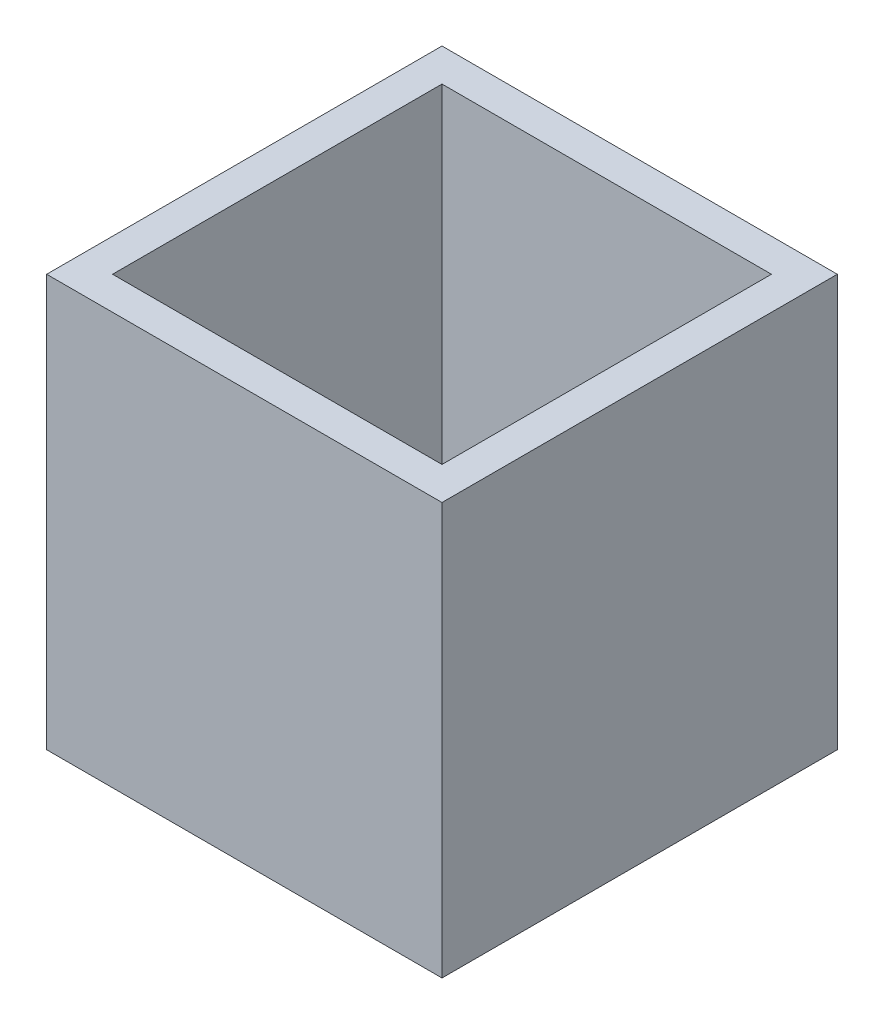
ISO-10303-21;
HEADER;
FILE_DESCRIPTION(('STEP AP214'),'2;1');
FILE_NAME('part.step','',(''),(''),'','','');
FILE_SCHEMA(('AUTOMOTIVE_DESIGN { 1 0 10303 214 1 1 1 1 }'));
ENDSEC;
DATA;
#1=APPLICATION_CONTEXT('core data for automotive mechanical design processes');
#2=APPLICATION_PROTOCOL_DEFINITION('international standard','automotive_design',2000,#1);
#3=PRODUCT_CONTEXT('',#1,'mechanical');
#4=PRODUCT('Part','Part','',(#3));
#5=PRODUCT_RELATED_PRODUCT_CATEGORY('part','',(#4));
#6=PRODUCT_DEFINITION_FORMATION('','',#4);
#7=PRODUCT_DEFINITION_CONTEXT('part definition',#1,'design');
#8=PRODUCT_DEFINITION('design','',#6,#7);
#9=PRODUCT_DEFINITION_SHAPE('','',#8);
#10=(LENGTH_UNIT() NAMED_UNIT(*) SI_UNIT(.MILLI.,.METRE.));
#11=(NAMED_UNIT(*) PLANE_ANGLE_UNIT() SI_UNIT($,.RADIAN.));
#12=(NAMED_UNIT(*) SI_UNIT($,.STERADIAN.) SOLID_ANGLE_UNIT());
#13=UNCERTAINTY_MEASURE_WITH_UNIT(LENGTH_MEASURE(1.E-05),#10,'distance_accuracy_value','');
#14=(GEOMETRIC_REPRESENTATION_CONTEXT(3) GLOBAL_UNCERTAINTY_ASSIGNED_CONTEXT((#13)) GLOBAL_UNIT_ASSIGNED_CONTEXT((#10,
#11,#12)) REPRESENTATION_CONTEXT('',''));
#15=CARTESIAN_POINT('',(0.,0.,0.));
#16=DIRECTION('',(0.,0.,1.));
#17=DIRECTION('',(1.,0.,0.));
#18=AXIS2_PLACEMENT_3D('',#15,#16,#17);
#19=CARTESIAN_POINT('',(0.,5.,0.));
#20=DIRECTION('',(0.,-1.,0.));
#21=DIRECTION('',(0.,0.,-1.));
#22=AXIS2_PLACEMENT_3D('',#19,#20,#21);
#23=PLANE('',#22);
#24=DIRECTION('',(0.,0.,-1.));
#25=VECTOR('',#24,1.);
#26=CARTESIAN_POINT('',(2.4,5.,2.4));
#27=LINE('',#26,#25);
#28=CARTESIAN_POINT('',(2.4,5.,2.4));
#29=VERTEX_POINT('',#28);
#30=CARTESIAN_POINT('',(2.4,5.,-2.4));
#31=VERTEX_POINT('',#30);
#32=EDGE_CURVE('E138',#29,#31,#27,.T.);
#33=ORIENTED_EDGE('',*,*,#32,.T.);
#34=DIRECTION('',(-1.,0.,0.));
#35=VECTOR('',#34,1.);
#36=CARTESIAN_POINT('',(-2.4,5.,-2.4));
#37=LINE('',#36,#35);
#38=CARTESIAN_POINT('',(-2.4,5.,-2.4));
#39=VERTEX_POINT('',#38);
#40=EDGE_CURVE('E141',#31,#39,#37,.T.);
#41=ORIENTED_EDGE('',*,*,#40,.T.);
#42=DIRECTION('',(0.,0.,1.));
#43=VECTOR('',#42,1.);
#44=CARTESIAN_POINT('',(-2.4,5.,2.4));
#45=LINE('',#44,#43);
#46=CARTESIAN_POINT('',(-2.4,5.,2.4));
#47=VERTEX_POINT('',#46);
#48=EDGE_CURVE('E144',#39,#47,#45,.T.);
#49=ORIENTED_EDGE('',*,*,#48,.T.);
#50=DIRECTION('',(1.,0.,0.));
#51=VECTOR('',#50,1.);
#52=CARTESIAN_POINT('',(-2.4,5.,2.4));
#53=LINE('',#52,#51);
#54=EDGE_CURVE('E146',#47,#29,#53,.T.);
#55=ORIENTED_EDGE('',*,*,#54,.T.);
#56=EDGE_LOOP('',(#33,#41,#49,#55));
#57=FACE_BOUND('',#56,.T.);
#58=DIRECTION('',(0.,0.,-1.));
#59=VECTOR('',#58,1.);
#60=CARTESIAN_POINT('',(2.,5.,2.));
#61=LINE('',#60,#59);
#62=CARTESIAN_POINT('',(2.,5.,2.));
#63=VERTEX_POINT('',#62);
#64=CARTESIAN_POINT('',(2.,5.,-2.));
#65=VERTEX_POINT('',#64);
#66=EDGE_CURVE('E102',#63,#65,#61,.T.);
#67=ORIENTED_EDGE('',*,*,#66,.F.);
#68=DIRECTION('',(1.,0.,0.));
#69=VECTOR('',#68,1.);
#70=CARTESIAN_POINT('',(-2.,5.,2.));
#71=LINE('',#70,#69);
#72=CARTESIAN_POINT('',(-2.,5.,2.));
#73=VERTEX_POINT('',#72);
#74=EDGE_CURVE('E124',#73,#63,#71,.T.);
#75=ORIENTED_EDGE('',*,*,#74,.F.);
#76=DIRECTION('',(0.,0.,1.));
#77=VECTOR('',#76,1.);
#78=CARTESIAN_POINT('',(-2.,5.,2.));
#79=LINE('',#78,#77);
#80=CARTESIAN_POINT('',(-2.,5.,-2.));
#81=VERTEX_POINT('',#80);
#82=EDGE_CURVE('E122',#81,#73,#79,.T.);
#83=ORIENTED_EDGE('',*,*,#82,.F.);
#84=DIRECTION('',(-1.,0.,0.));
#85=VECTOR('',#84,1.);
#86=CARTESIAN_POINT('',(-2.,5.,-2.));
#87=LINE('',#86,#85);
#88=EDGE_CURVE('E110',#65,#81,#87,.T.);
#89=ORIENTED_EDGE('',*,*,#88,.F.);
#90=EDGE_LOOP('',(#67,#75,#83,#89));
#91=FACE_BOUND('',#90,.T.);
#92=ADVANCED_FACE('F37',(#57,#91),#23,.F.);
#93=CARTESIAN_POINT('',(0.,0.,0.));
#94=DIRECTION('',(0.,-1.,0.));
#95=DIRECTION('',(0.,0.,-1.));
#96=AXIS2_PLACEMENT_3D('',#93,#94,#95);
#97=PLANE('',#96);
#98=DIRECTION('',(0.,0.,-1.));
#99=VECTOR('',#98,1.);
#100=CARTESIAN_POINT('',(2.4,0.,2.4));
#101=LINE('',#100,#99);
#102=CARTESIAN_POINT('',(2.4,0.,2.4));
#103=VERTEX_POINT('',#102);
#104=CARTESIAN_POINT('',(2.4,0.,-2.4));
#105=VERTEX_POINT('',#104);
#106=EDGE_CURVE('E118',#103,#105,#101,.T.);
#107=ORIENTED_EDGE('',*,*,#106,.F.);
#108=DIRECTION('',(1.,0.,0.));
#109=VECTOR('',#108,1.);
#110=CARTESIAN_POINT('',(-2.4,0.,2.4));
#111=LINE('',#110,#109);
#112=CARTESIAN_POINT('',(-2.4,0.,2.4));
#113=VERTEX_POINT('',#112);
#114=EDGE_CURVE('E142',#113,#103,#111,.T.);
#115=ORIENTED_EDGE('',*,*,#114,.F.);
#116=DIRECTION('',(0.,0.,1.));
#117=VECTOR('',#116,1.);
#118=CARTESIAN_POINT('',(-2.4,0.,2.4));
#119=LINE('',#118,#117);
#120=CARTESIAN_POINT('',(-2.4,0.,-2.4));
#121=VERTEX_POINT('',#120);
#122=EDGE_CURVE('E153',#121,#113,#119,.T.);
#123=ORIENTED_EDGE('',*,*,#122,.F.);
#124=DIRECTION('',(-1.,0.,0.));
#125=VECTOR('',#124,1.);
#126=CARTESIAN_POINT('',(-2.4,0.,-2.4));
#127=LINE('',#126,#125);
#128=EDGE_CURVE('E151',#105,#121,#127,.T.);
#129=ORIENTED_EDGE('',*,*,#128,.F.);
#130=EDGE_LOOP('',(#107,#115,#123,#129));
#131=FACE_BOUND('',#130,.T.);
#132=DIRECTION('',(1.,0.,0.));
#133=VECTOR('',#132,1.);
#134=CARTESIAN_POINT('',(-2.,0.,2.));
#135=LINE('',#134,#133);
#136=CARTESIAN_POINT('',(-2.,0.,2.));
#137=VERTEX_POINT('',#136);
#138=CARTESIAN_POINT('',(2.,0.,2.));
#139=VERTEX_POINT('',#138);
#140=EDGE_CURVE('E111',#137,#139,#135,.T.);
#141=ORIENTED_EDGE('',*,*,#140,.T.);
#142=DIRECTION('',(0.,0.,-1.));
#143=VECTOR('',#142,1.);
#144=CARTESIAN_POINT('',(2.,0.,2.));
#145=LINE('',#144,#143);
#146=CARTESIAN_POINT('',(2.,0.,-2.));
#147=VERTEX_POINT('',#146);
#148=EDGE_CURVE('E60',#139,#147,#145,.T.);
#149=ORIENTED_EDGE('',*,*,#148,.T.);
#150=DIRECTION('',(-1.,0.,0.));
#151=VECTOR('',#150,1.);
#152=CARTESIAN_POINT('',(-2.,0.,-2.));
#153=LINE('',#152,#151);
#154=CARTESIAN_POINT('',(-2.,0.,-2.));
#155=VERTEX_POINT('',#154);
#156=EDGE_CURVE('E117',#147,#155,#153,.T.);
#157=ORIENTED_EDGE('',*,*,#156,.T.);
#158=DIRECTION('',(0.,0.,1.));
#159=VECTOR('',#158,1.);
#160=CARTESIAN_POINT('',(-2.,0.,2.));
#161=LINE('',#160,#159);
#162=EDGE_CURVE('E130',#155,#137,#161,.T.);
#163=ORIENTED_EDGE('',*,*,#162,.T.);
#164=EDGE_LOOP('',(#141,#149,#157,#163));
#165=FACE_BOUND('',#164,.T.);
#166=ADVANCED_FACE('F171',(#131,#165),#97,.T.);
#167=CARTESIAN_POINT('',(2.4,5.,2.4));
#168=DIRECTION('',(-1.,0.,0.));
#169=DIRECTION('',(0.,0.,1.));
#170=AXIS2_PLACEMENT_3D('',#167,#168,#169);
#171=PLANE('',#170);
#172=ORIENTED_EDGE('',*,*,#106,.T.);
#173=DIRECTION('',(0.,-1.,0.));
#174=VECTOR('',#173,1.);
#175=CARTESIAN_POINT('',(2.4,5.,-2.4));
#176=LINE('',#175,#174);
#177=EDGE_CURVE('E11',#31,#105,#176,.T.);
#178=ORIENTED_EDGE('',*,*,#177,.F.);
#179=ORIENTED_EDGE('',*,*,#32,.F.);
#180=DIRECTION('',(0.,-1.,0.));
#181=VECTOR('',#180,1.);
#182=CARTESIAN_POINT('',(2.4,5.,2.4));
#183=LINE('',#182,#181);
#184=EDGE_CURVE('E148',#29,#103,#183,.T.);
#185=ORIENTED_EDGE('',*,*,#184,.T.);
#186=EDGE_LOOP('',(#172,#178,#179,#185));
#187=FACE_BOUND('',#186,.T.);
#188=ADVANCED_FACE('F39',(#187),#171,.F.);
#189=CARTESIAN_POINT('',(-2.4,5.,-2.4));
#190=DIRECTION('',(0.,0.,1.));
#191=DIRECTION('',(1.,0.,0.));
#192=AXIS2_PLACEMENT_3D('',#189,#190,#191);
#193=PLANE('',#192);
#194=ORIENTED_EDGE('',*,*,#128,.T.);
#195=DIRECTION('',(0.,-1.,0.));
#196=VECTOR('',#195,1.);
#197=CARTESIAN_POINT('',(-2.4,5.,-2.4));
#198=LINE('',#197,#196);
#199=EDGE_CURVE('E45',#39,#121,#198,.T.);
#200=ORIENTED_EDGE('',*,*,#199,.F.);
#201=ORIENTED_EDGE('',*,*,#40,.F.);
#202=ORIENTED_EDGE('',*,*,#177,.T.);
#203=EDGE_LOOP('',(#194,#200,#201,#202));
#204=FACE_BOUND('',#203,.T.);
#205=ADVANCED_FACE('F181',(#204),#193,.F.);
#206=CARTESIAN_POINT('',(-2.4,5.,2.4));
#207=DIRECTION('',(1.,0.,0.));
#208=DIRECTION('',(0.,0.,-1.));
#209=AXIS2_PLACEMENT_3D('',#206,#207,#208);
#210=PLANE('',#209);
#211=ORIENTED_EDGE('',*,*,#122,.T.);
#212=DIRECTION('',(0.,-1.,0.));
#213=VECTOR('',#212,1.);
#214=CARTESIAN_POINT('',(-2.4,5.,2.4));
#215=LINE('',#214,#213);
#216=EDGE_CURVE('E158',#47,#113,#215,.T.);
#217=ORIENTED_EDGE('',*,*,#216,.F.);
#218=ORIENTED_EDGE('',*,*,#48,.F.);
#219=ORIENTED_EDGE('',*,*,#199,.T.);
#220=EDGE_LOOP('',(#211,#217,#218,#219));
#221=FACE_BOUND('',#220,.T.);
#222=ADVANCED_FACE('F165',(#221),#210,.F.);
#223=CARTESIAN_POINT('',(-2.4,5.,2.4));
#224=DIRECTION('',(0.,0.,-1.));
#225=DIRECTION('',(-1.,0.,0.));
#226=AXIS2_PLACEMENT_3D('',#223,#224,#225);
#227=PLANE('',#226);
#228=ORIENTED_EDGE('',*,*,#114,.T.);
#229=ORIENTED_EDGE('',*,*,#184,.F.);
#230=ORIENTED_EDGE('',*,*,#54,.F.);
#231=ORIENTED_EDGE('',*,*,#216,.T.);
#232=EDGE_LOOP('',(#228,#229,#230,#231));
#233=FACE_BOUND('',#232,.T.);
#234=ADVANCED_FACE('F175',(#233),#227,.F.);
#235=CARTESIAN_POINT('',(2.,5.,2.));
#236=DIRECTION('',(-1.,0.,0.));
#237=DIRECTION('',(0.,0.,1.));
#238=AXIS2_PLACEMENT_3D('',#235,#236,#237);
#239=PLANE('',#238);
#240=ORIENTED_EDGE('',*,*,#148,.F.);
#241=DIRECTION('',(0.,-1.,0.));
#242=VECTOR('',#241,1.);
#243=CARTESIAN_POINT('',(2.,5.,2.));
#244=LINE('',#243,#242);
#245=EDGE_CURVE('E106',#63,#139,#244,.T.);
#246=ORIENTED_EDGE('',*,*,#245,.F.);
#247=ORIENTED_EDGE('',*,*,#66,.T.);
#248=DIRECTION('',(0.,-1.,0.));
#249=VECTOR('',#248,1.);
#250=CARTESIAN_POINT('',(2.,5.,-2.));
#251=LINE('',#250,#249);
#252=EDGE_CURVE('E105',#65,#147,#251,.T.);
#253=ORIENTED_EDGE('',*,*,#252,.T.);
#254=EDGE_LOOP('',(#240,#246,#247,#253));
#255=FACE_BOUND('',#254,.T.);
#256=ADVANCED_FACE('F104',(#255),#239,.T.);
#257=CARTESIAN_POINT('',(-2.,5.,-2.));
#258=DIRECTION('',(0.,0.,1.));
#259=DIRECTION('',(1.,0.,0.));
#260=AXIS2_PLACEMENT_3D('',#257,#258,#259);
#261=PLANE('',#260);
#262=ORIENTED_EDGE('',*,*,#156,.F.);
#263=ORIENTED_EDGE('',*,*,#252,.F.);
#264=ORIENTED_EDGE('',*,*,#88,.T.);
#265=DIRECTION('',(0.,-1.,0.));
#266=VECTOR('',#265,1.);
#267=CARTESIAN_POINT('',(-2.,5.,-2.));
#268=LINE('',#267,#266);
#269=EDGE_CURVE('E119',#81,#155,#268,.T.);
#270=ORIENTED_EDGE('',*,*,#269,.T.);
#271=EDGE_LOOP('',(#262,#263,#264,#270));
#272=FACE_BOUND('',#271,.T.);
#273=ADVANCED_FACE('F114',(#272),#261,.T.);
#274=CARTESIAN_POINT('',(-2.,5.,2.));
#275=DIRECTION('',(1.,0.,0.));
#276=DIRECTION('',(0.,0.,-1.));
#277=AXIS2_PLACEMENT_3D('',#274,#275,#276);
#278=PLANE('',#277);
#279=ORIENTED_EDGE('',*,*,#162,.F.);
#280=ORIENTED_EDGE('',*,*,#269,.F.);
#281=ORIENTED_EDGE('',*,*,#82,.T.);
#282=DIRECTION('',(0.,-1.,0.));
#283=VECTOR('',#282,1.);
#284=CARTESIAN_POINT('',(-2.,5.,2.));
#285=LINE('',#284,#283);
#286=EDGE_CURVE('E52',#73,#137,#285,.T.);
#287=ORIENTED_EDGE('',*,*,#286,.T.);
#288=EDGE_LOOP('',(#279,#280,#281,#287));
#289=FACE_BOUND('',#288,.T.);
#290=ADVANCED_FACE('F204',(#289),#278,.T.);
#291=CARTESIAN_POINT('',(-2.,5.,2.));
#292=DIRECTION('',(0.,0.,-1.));
#293=DIRECTION('',(-1.,0.,0.));
#294=AXIS2_PLACEMENT_3D('',#291,#292,#293);
#295=PLANE('',#294);
#296=ORIENTED_EDGE('',*,*,#140,.F.);
#297=ORIENTED_EDGE('',*,*,#286,.F.);
#298=ORIENTED_EDGE('',*,*,#74,.T.);
#299=ORIENTED_EDGE('',*,*,#245,.T.);
#300=EDGE_LOOP('',(#296,#297,#298,#299));
#301=FACE_BOUND('',#300,.T.);
#302=ADVANCED_FACE('F208',(#301),#295,.T.);
#303=CLOSED_SHELL('',(#92,#166,#188,#205,#222,#234,#256,#273,#290,#302));
#304=MANIFOLD_SOLID_BREP('B2',#303);
#305=ADVANCED_BREP_SHAPE_REPRESENTATION('',(#18,#304),#14);
#306=SHAPE_DEFINITION_REPRESENTATION(#9,#305);
ENDSEC;
END-ISO-10303-21;
